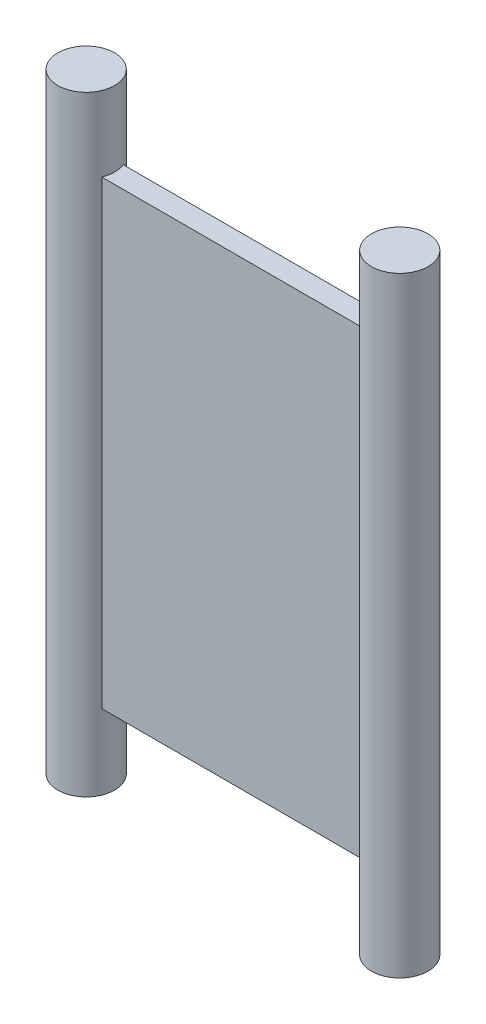
ISO-10303-21;
HEADER;
FILE_DESCRIPTION(('STEP AP214'),'2;1');
FILE_NAME('part.step','',(''),(''),'','','');
FILE_SCHEMA(('AUTOMOTIVE_DESIGN { 1 0 10303 214 1 1 1 1 }'));
ENDSEC;
DATA;
#1=APPLICATION_CONTEXT('core data for automotive mechanical design processes');
#2=APPLICATION_PROTOCOL_DEFINITION('international standard','automotive_design',2000,#1);
#3=PRODUCT_CONTEXT('',#1,'mechanical');
#4=PRODUCT('Part','Part','',(#3));
#5=PRODUCT_RELATED_PRODUCT_CATEGORY('part','',(#4));
#6=PRODUCT_DEFINITION_FORMATION('','',#4);
#7=PRODUCT_DEFINITION_CONTEXT('part definition',#1,'design');
#8=PRODUCT_DEFINITION('design','',#6,#7);
#9=PRODUCT_DEFINITION_SHAPE('','',#8);
#10=(LENGTH_UNIT() NAMED_UNIT(*) SI_UNIT(.MILLI.,.METRE.));
#11=(NAMED_UNIT(*) PLANE_ANGLE_UNIT() SI_UNIT($,.RADIAN.));
#12=(NAMED_UNIT(*) SI_UNIT($,.STERADIAN.) SOLID_ANGLE_UNIT());
#13=UNCERTAINTY_MEASURE_WITH_UNIT(LENGTH_MEASURE(1.E-05),#10,'distance_accuracy_value','');
#14=(GEOMETRIC_REPRESENTATION_CONTEXT(3) GLOBAL_UNCERTAINTY_ASSIGNED_CONTEXT((#13)) GLOBAL_UNIT_ASSIGNED_CONTEXT((#10,
#11,#12)) REPRESENTATION_CONTEXT('',''));
#15=CARTESIAN_POINT('',(0.,0.,0.));
#16=DIRECTION('',(0.,0.,1.));
#17=DIRECTION('',(1.,0.,0.));
#18=AXIS2_PLACEMENT_3D('',#15,#16,#17);
#19=CARTESIAN_POINT('',(7.3215,21.5,0.499999999999999));
#20=DIRECTION('',(0.,0.,-1.));
#21=DIRECTION('',(-1.,0.,0.));
#22=AXIS2_PLACEMENT_3D('',#19,#20,#21);
#23=PLANE('',#22);
#24=DIRECTION('',(0.,-1.,0.));
#25=VECTOR('',#24,1.);
#26=CARTESIAN_POINT('',(6.0944608808192,25.,0.499999999999999));
#27=LINE('',#26,#25);
#28=CARTESIAN_POINT('',(6.0944608808192,21.5,0.499999999999999));
#29=VERTEX_POINT('',#28);
#30=CARTESIAN_POINT('',(6.0944608808192,0.,0.499999999999999));
#31=VERTEX_POINT('',#30);
#32=EDGE_CURVE('E53',#29,#31,#27,.T.);
#33=ORIENTED_EDGE('',*,*,#32,.F.);
#34=DIRECTION('',(1.,0.,0.));
#35=VECTOR('',#34,1.);
#36=CARTESIAN_POINT('',(7.3215,21.5,0.499999999999999));
#37=LINE('',#36,#35);
#38=CARTESIAN_POINT('',(-6.0944608808192,21.5,0.500000000000001));
#39=VERTEX_POINT('',#38);
#40=EDGE_CURVE('E90',#39,#29,#37,.T.);
#41=ORIENTED_EDGE('',*,*,#40,.F.);
#42=DIRECTION('',(0.,-1.,0.));
#43=VECTOR('',#42,1.);
#44=CARTESIAN_POINT('',(-6.0944608808192,25.,0.500000000000001));
#45=LINE('',#44,#43);
#46=CARTESIAN_POINT('',(-6.0944608808192,0.,0.500000000000001));
#47=VERTEX_POINT('',#46);
#48=EDGE_CURVE('E103',#47,#39,#45,.F.);
#49=ORIENTED_EDGE('',*,*,#48,.F.);
#50=DIRECTION('',(1.,0.,0.));
#51=VECTOR('',#50,1.);
#52=CARTESIAN_POINT('',(7.3215,0.,0.499999999999999));
#53=LINE('',#52,#51);
#54=EDGE_CURVE('E91',#47,#31,#53,.T.);
#55=ORIENTED_EDGE('',*,*,#54,.T.);
#56=EDGE_LOOP('',(#33,#41,#49,#55));
#57=FACE_BOUND('',#56,.T.);
#58=ADVANCED_FACE('F39',(#57),#23,.F.);
#59=CARTESIAN_POINT('',(7.3215,21.5,-0.500000000000001));
#60=DIRECTION('',(0.,0.,1.));
#61=DIRECTION('',(1.,0.,0.));
#62=AXIS2_PLACEMENT_3D('',#59,#60,#61);
#63=PLANE('',#62);
#64=DIRECTION('',(0.,-1.,0.));
#65=VECTOR('',#64,1.);
#66=CARTESIAN_POINT('',(6.0944608808192,25.,-0.500000000000001));
#67=LINE('',#66,#65);
#68=CARTESIAN_POINT('',(6.0944608808192,0.,-0.500000000000001));
#69=VERTEX_POINT('',#68);
#70=CARTESIAN_POINT('',(6.0944608808192,21.5,-0.500000000000001));
#71=VERTEX_POINT('',#70);
#72=EDGE_CURVE('E78',#69,#71,#67,.F.);
#73=ORIENTED_EDGE('',*,*,#72,.F.);
#74=DIRECTION('',(-1.,0.,0.));
#75=VECTOR('',#74,1.);
#76=CARTESIAN_POINT('',(7.3215,0.,-0.500000000000001));
#77=LINE('',#76,#75);
#78=CARTESIAN_POINT('',(-6.0944608808192,0.,-0.499999999999999));
#79=VERTEX_POINT('',#78);
#80=EDGE_CURVE('E60',#69,#79,#77,.T.);
#81=ORIENTED_EDGE('',*,*,#80,.T.);
#82=DIRECTION('',(0.,-1.,0.));
#83=VECTOR('',#82,1.);
#84=CARTESIAN_POINT('',(-6.0944608808192,25.,-0.499999999999999));
#85=LINE('',#84,#83);
#86=CARTESIAN_POINT('',(-6.0944608808192,21.5,-0.499999999999999));
#87=VERTEX_POINT('',#86);
#88=EDGE_CURVE('E105',#87,#79,#85,.T.);
#89=ORIENTED_EDGE('',*,*,#88,.F.);
#90=DIRECTION('',(-1.,0.,0.));
#91=VECTOR('',#90,1.);
#92=CARTESIAN_POINT('',(7.3215,21.5,-0.500000000000001));
#93=LINE('',#92,#91);
#94=EDGE_CURVE('E85',#71,#87,#93,.T.);
#95=ORIENTED_EDGE('',*,*,#94,.F.);
#96=EDGE_LOOP('',(#73,#81,#89,#95));
#97=FACE_BOUND('',#96,.T.);
#98=ADVANCED_FACE('F84',(#97),#63,.F.);
#99=CARTESIAN_POINT('',(-7.3215,25.,0.));
#100=DIRECTION('',(0.,-1.,0.));
#101=DIRECTION('',(0.,0.,-1.));
#102=AXIS2_PLACEMENT_3D('',#99,#100,#101);
#103=CYLINDRICAL_SURFACE('',#102,1.325);
#104=CARTESIAN_POINT('',(-7.3215,25.,0.));
#105=DIRECTION('',(0.,1.,0.));
#106=DIRECTION('',(0.,0.,1.));
#107=AXIS2_PLACEMENT_3D('',#104,#105,#106);
#108=CIRCLE('',#107,1.325);
#109=CARTESIAN_POINT('',(-7.3215,25.,1.325));
#110=VERTEX_POINT('',#109);
#111=EDGE_CURVE('E107',#110,#110,#108,.T.);
#112=ORIENTED_EDGE('',*,*,#111,.F.);
#113=EDGE_LOOP('',(#112));
#114=FACE_BOUND('',#113,.T.);
#115=CARTESIAN_POINT('',(-7.3215,-3.5,0.));
#116=DIRECTION('',(0.,1.,0.));
#117=DIRECTION('',(0.,0.,1.));
#118=AXIS2_PLACEMENT_3D('',#115,#116,#117);
#119=CIRCLE('',#118,1.325);
#120=CARTESIAN_POINT('',(-7.3215,-3.5,1.325));
#121=VERTEX_POINT('',#120);
#122=EDGE_CURVE('E108',#121,#121,#119,.T.);
#123=ORIENTED_EDGE('',*,*,#122,.T.);
#124=EDGE_LOOP('',(#123));
#125=FACE_BOUND('',#124,.T.);
#126=ORIENTED_EDGE('',*,*,#48,.T.);
#127=CARTESIAN_POINT('',(-7.3215,21.5,0.));
#128=DIRECTION('',(0.,-1.,0.));
#129=DIRECTION('',(0.,0.,-1.));
#130=AXIS2_PLACEMENT_3D('',#127,#128,#129);
#131=CIRCLE('',#130,1.325);
#132=EDGE_CURVE('E95',#39,#87,#131,.F.);
#133=ORIENTED_EDGE('',*,*,#132,.T.);
#134=ORIENTED_EDGE('',*,*,#88,.T.);
#135=CARTESIAN_POINT('',(-7.3215,0.,0.));
#136=DIRECTION('',(0.,-1.,0.));
#137=DIRECTION('',(0.,0.,-1.));
#138=AXIS2_PLACEMENT_3D('',#135,#136,#137);
#139=CIRCLE('',#138,1.325);
#140=EDGE_CURVE('E46',#47,#79,#139,.F.);
#141=ORIENTED_EDGE('',*,*,#140,.F.);
#142=EDGE_LOOP('',(#126,#133,#134,#141));
#143=FACE_BOUND('',#142,.T.);
#144=ADVANCED_FACE('F138',(#114,#125,#143),#103,.T.);
#145=CARTESIAN_POINT('',(-7.3215,25.,0.));
#146=DIRECTION('',(0.,1.,0.));
#147=DIRECTION('',(0.,0.,1.));
#148=AXIS2_PLACEMENT_3D('',#145,#146,#147);
#149=PLANE('',#148);
#150=ORIENTED_EDGE('',*,*,#111,.T.);
#151=EDGE_LOOP('',(#150));
#152=FACE_BOUND('',#151,.T.);
#153=ADVANCED_FACE('F144',(#152),#149,.T.);
#154=CARTESIAN_POINT('',(-7.3215,-3.5,0.));
#155=DIRECTION('',(0.,1.,0.));
#156=DIRECTION('',(0.,0.,1.));
#157=AXIS2_PLACEMENT_3D('',#154,#155,#156);
#158=PLANE('',#157);
#159=ORIENTED_EDGE('',*,*,#122,.F.);
#160=EDGE_LOOP('',(#159));
#161=FACE_BOUND('',#160,.T.);
#162=ADVANCED_FACE('F150',(#161),#158,.F.);
#163=CARTESIAN_POINT('',(0.,21.5,0.));
#164=DIRECTION('',(0.,-1.,0.));
#165=DIRECTION('',(0.,0.,-1.));
#166=AXIS2_PLACEMENT_3D('',#163,#164,#165);
#167=PLANE('',#166);
#168=CARTESIAN_POINT('',(7.3215,21.5,0.));
#169=DIRECTION('',(0.,-1.,0.));
#170=DIRECTION('',(0.,0.,-1.));
#171=AXIS2_PLACEMENT_3D('',#168,#169,#170);
#172=CIRCLE('',#171,1.325);
#173=EDGE_CURVE('E111',#71,#29,#172,.F.);
#174=ORIENTED_EDGE('',*,*,#173,.F.);
#175=ORIENTED_EDGE('',*,*,#94,.T.);
#176=ORIENTED_EDGE('',*,*,#132,.F.);
#177=ORIENTED_EDGE('',*,*,#40,.T.);
#178=EDGE_LOOP('',(#174,#175,#176,#177));
#179=FACE_BOUND('',#178,.T.);
#180=ADVANCED_FACE('F141',(#179),#167,.F.);
#181=CARTESIAN_POINT('',(0.,0.,0.));
#182=DIRECTION('',(0.,-1.,0.));
#183=DIRECTION('',(0.,0.,-1.));
#184=AXIS2_PLACEMENT_3D('',#181,#182,#183);
#185=PLANE('',#184);
#186=ORIENTED_EDGE('',*,*,#80,.F.);
#187=CARTESIAN_POINT('',(7.3215,0.,0.));
#188=DIRECTION('',(0.,-1.,0.));
#189=DIRECTION('',(0.,0.,-1.));
#190=AXIS2_PLACEMENT_3D('',#187,#188,#189);
#191=CIRCLE('',#190,1.325);
#192=EDGE_CURVE('E11',#69,#31,#191,.F.);
#193=ORIENTED_EDGE('',*,*,#192,.T.);
#194=ORIENTED_EDGE('',*,*,#54,.F.);
#195=ORIENTED_EDGE('',*,*,#140,.T.);
#196=EDGE_LOOP('',(#186,#193,#194,#195));
#197=FACE_BOUND('',#196,.T.);
#198=ADVANCED_FACE('F89',(#197),#185,.T.);
#199=CARTESIAN_POINT('',(7.3215,25.,0.));
#200=DIRECTION('',(0.,-1.,0.));
#201=DIRECTION('',(0.,0.,-1.));
#202=AXIS2_PLACEMENT_3D('',#199,#200,#201);
#203=CYLINDRICAL_SURFACE('',#202,1.325);
#204=CARTESIAN_POINT('',(7.3215,25.,0.));
#205=DIRECTION('',(0.,1.,0.));
#206=DIRECTION('',(0.,0.,1.));
#207=AXIS2_PLACEMENT_3D('',#204,#205,#206);
#208=CIRCLE('',#207,1.325);
#209=CARTESIAN_POINT('',(7.3215,25.,1.325));
#210=VERTEX_POINT('',#209);
#211=EDGE_CURVE('E116',#210,#210,#208,.T.);
#212=ORIENTED_EDGE('',*,*,#211,.F.);
#213=EDGE_LOOP('',(#212));
#214=FACE_BOUND('',#213,.T.);
#215=CARTESIAN_POINT('',(7.3215,-3.5,0.));
#216=DIRECTION('',(0.,1.,0.));
#217=DIRECTION('',(0.,0.,1.));
#218=AXIS2_PLACEMENT_3D('',#215,#216,#217);
#219=CIRCLE('',#218,1.325);
#220=CARTESIAN_POINT('',(7.3215,-3.5,1.325));
#221=VERTEX_POINT('',#220);
#222=EDGE_CURVE('E86',#221,#221,#219,.T.);
#223=ORIENTED_EDGE('',*,*,#222,.T.);
#224=EDGE_LOOP('',(#223));
#225=FACE_BOUND('',#224,.T.);
#226=ORIENTED_EDGE('',*,*,#72,.T.);
#227=ORIENTED_EDGE('',*,*,#173,.T.);
#228=ORIENTED_EDGE('',*,*,#32,.T.);
#229=ORIENTED_EDGE('',*,*,#192,.F.);
#230=EDGE_LOOP('',(#226,#227,#228,#229));
#231=FACE_BOUND('',#230,.T.);
#232=ADVANCED_FACE('F77',(#214,#225,#231),#203,.T.);
#233=CARTESIAN_POINT('',(7.3215,25.,0.));
#234=DIRECTION('',(0.,1.,0.));
#235=DIRECTION('',(0.,0.,1.));
#236=AXIS2_PLACEMENT_3D('',#233,#234,#235);
#237=PLANE('',#236);
#238=ORIENTED_EDGE('',*,*,#211,.T.);
#239=EDGE_LOOP('',(#238));
#240=FACE_BOUND('',#239,.T.);
#241=ADVANCED_FACE('F125',(#240),#237,.T.);
#242=CARTESIAN_POINT('',(7.3215,-3.5,0.));
#243=DIRECTION('',(0.,1.,0.));
#244=DIRECTION('',(0.,0.,1.));
#245=AXIS2_PLACEMENT_3D('',#242,#243,#244);
#246=PLANE('',#245);
#247=ORIENTED_EDGE('',*,*,#222,.F.);
#248=EDGE_LOOP('',(#247));
#249=FACE_BOUND('',#248,.T.);
#250=ADVANCED_FACE('F123',(#249),#246,.F.);
#251=CLOSED_SHELL('',(#58,#98,#144,#153,#162,#180,#198,#232,#241,#250));
#252=MANIFOLD_SOLID_BREP('B2',#251);
#253=ADVANCED_BREP_SHAPE_REPRESENTATION('',(#18,#252),#14);
#254=SHAPE_DEFINITION_REPRESENTATION(#9,#253);
ENDSEC;
END-ISO-10303-21;
